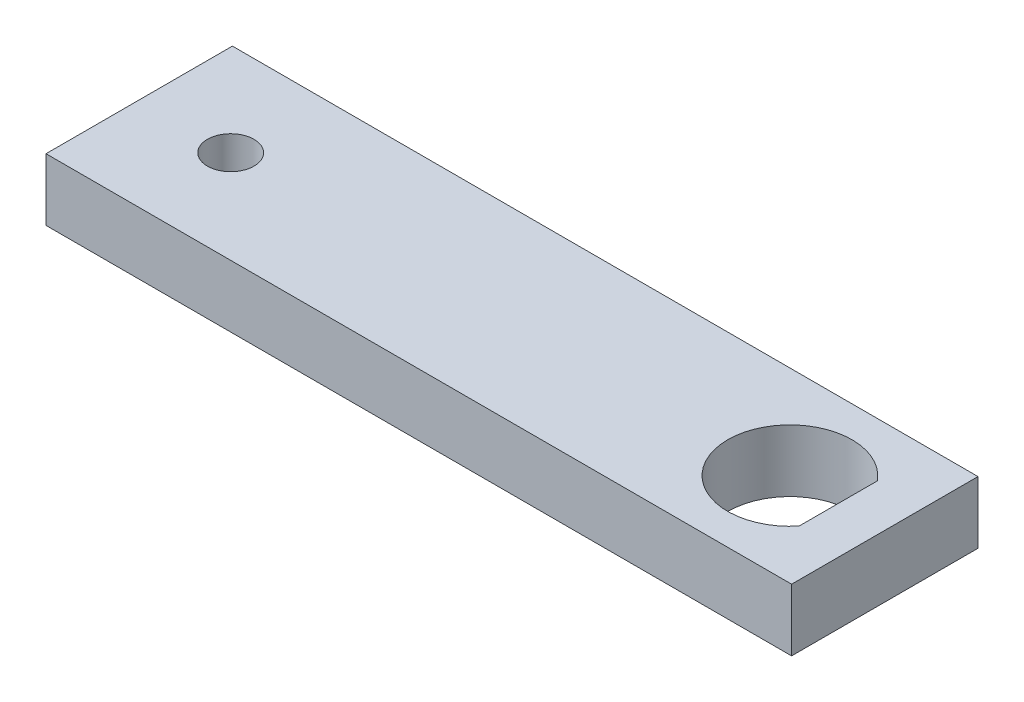
ISO-10303-21;
HEADER;
FILE_DESCRIPTION(('STEP AP214'),'2;1');
FILE_NAME('part.step','',(''),(''),'','','');
FILE_SCHEMA(('AUTOMOTIVE_DESIGN { 1 0 10303 214 1 1 1 1 }'));
ENDSEC;
DATA;
#1=APPLICATION_CONTEXT('core data for automotive mechanical design processes');
#2=APPLICATION_PROTOCOL_DEFINITION('international standard','automotive_design',2000,#1);
#3=PRODUCT_CONTEXT('',#1,'mechanical');
#4=PRODUCT('Part','Part','',(#3));
#5=PRODUCT_RELATED_PRODUCT_CATEGORY('part','',(#4));
#6=PRODUCT_DEFINITION_FORMATION('','',#4);
#7=PRODUCT_DEFINITION_CONTEXT('part definition',#1,'design');
#8=PRODUCT_DEFINITION('design','',#6,#7);
#9=PRODUCT_DEFINITION_SHAPE('','',#8);
#10=(LENGTH_UNIT() NAMED_UNIT(*) SI_UNIT(.MILLI.,.METRE.));
#11=(NAMED_UNIT(*) PLANE_ANGLE_UNIT() SI_UNIT($,.RADIAN.));
#12=(NAMED_UNIT(*) SI_UNIT($,.STERADIAN.) SOLID_ANGLE_UNIT());
#13=UNCERTAINTY_MEASURE_WITH_UNIT(LENGTH_MEASURE(1.E-05),#10,'distance_accuracy_value','');
#14=(GEOMETRIC_REPRESENTATION_CONTEXT(3) GLOBAL_UNCERTAINTY_ASSIGNED_CONTEXT((#13)) GLOBAL_UNIT_ASSIGNED_CONTEXT((#10,
#11,#12)) REPRESENTATION_CONTEXT('',''));
#15=CARTESIAN_POINT('',(0.,0.,0.));
#16=DIRECTION('',(0.,0.,1.));
#17=DIRECTION('',(1.,0.,0.));
#18=AXIS2_PLACEMENT_3D('',#15,#16,#17);
#19=CARTESIAN_POINT('',(0.,3.175,0.));
#20=DIRECTION('',(0.,-1.,0.));
#21=DIRECTION('',(0.,0.,-1.));
#22=AXIS2_PLACEMENT_3D('',#19,#20,#21);
#23=PLANE('',#22);
#24=DIRECTION('',(0.,0.,-1.));
#25=VECTOR('',#24,1.);
#26=CARTESIAN_POINT('',(38.1,3.175,9.525));
#27=LINE('',#26,#25);
#28=CARTESIAN_POINT('',(38.1,3.175,9.525));
#29=VERTEX_POINT('',#28);
#30=CARTESIAN_POINT('',(38.1,3.175,-9.525));
#31=VERTEX_POINT('',#30);
#32=EDGE_CURVE('E126',#29,#31,#27,.T.);
#33=ORIENTED_EDGE('',*,*,#32,.T.);
#34=DIRECTION('',(-1.,0.,0.));
#35=VECTOR('',#34,1.);
#36=CARTESIAN_POINT('',(-38.1,3.175,-9.525));
#37=LINE('',#36,#35);
#38=CARTESIAN_POINT('',(-38.1,3.175,-9.525));
#39=VERTEX_POINT('',#38);
#40=EDGE_CURVE('E130',#31,#39,#37,.T.);
#41=ORIENTED_EDGE('',*,*,#40,.T.);
#42=DIRECTION('',(0.,0.,1.));
#43=VECTOR('',#42,1.);
#44=CARTESIAN_POINT('',(-38.1,3.175,9.525));
#45=LINE('',#44,#43);
#46=CARTESIAN_POINT('',(-38.1,3.175,9.525));
#47=VERTEX_POINT('',#46);
#48=EDGE_CURVE('E134',#39,#47,#45,.T.);
#49=ORIENTED_EDGE('',*,*,#48,.T.);
#50=DIRECTION('',(1.,0.,0.));
#51=VECTOR('',#50,1.);
#52=CARTESIAN_POINT('',(-38.1,3.175,9.525));
#53=LINE('',#52,#51);
#54=EDGE_CURVE('E137',#47,#29,#53,.T.);
#55=ORIENTED_EDGE('',*,*,#54,.T.);
#56=EDGE_LOOP('',(#33,#41,#49,#55));
#57=FACE_BOUND('',#56,.T.);
#58=CARTESIAN_POINT('',(28.4,3.175,0.));
#59=DIRECTION('',(0.,1.,0.));
#60=DIRECTION('',(0.,0.,1.));
#61=AXIS2_PLACEMENT_3D('',#58,#59,#60);
#62=CIRCLE('',#61,6.35);
#63=CARTESIAN_POINT('',(33.34,3.175,-3.98984962122635));
#64=VERTEX_POINT('',#63);
#65=CARTESIAN_POINT('',(33.34,3.175,3.98984962122634));
#66=VERTEX_POINT('',#65);
#67=EDGE_CURVE('E105',#64,#66,#62,.T.);
#68=ORIENTED_EDGE('',*,*,#67,.F.);
#69=DIRECTION('',(0.,0.,-1.));
#70=VECTOR('',#69,1.);
#71=CARTESIAN_POINT('',(33.34,3.175,-3.98984962122635));
#72=LINE('',#71,#70);
#73=EDGE_CURVE('E98',#66,#64,#72,.T.);
#74=ORIENTED_EDGE('',*,*,#73,.F.);
#75=EDGE_LOOP('',(#68,#74));
#76=FACE_BOUND('',#75,.T.);
#77=CARTESIAN_POINT('',(-28.75,3.175,0.));
#78=DIRECTION('',(0.,1.,0.));
#79=DIRECTION('',(0.,0.,1.));
#80=AXIS2_PLACEMENT_3D('',#77,#78,#79);
#81=CIRCLE('',#80,2.38);
#82=CARTESIAN_POINT('',(-28.75,3.175,2.38));
#83=VERTEX_POINT('',#82);
#84=EDGE_CURVE('E121',#83,#83,#81,.T.);
#85=ORIENTED_EDGE('',*,*,#84,.F.);
#86=EDGE_LOOP('',(#85));
#87=FACE_BOUND('',#86,.T.);
#88=ADVANCED_FACE('F45',(#57,#76,#87),#23,.F.);
#89=CARTESIAN_POINT('',(0.,-3.175,0.));
#90=DIRECTION('',(0.,-1.,0.));
#91=DIRECTION('',(0.,0.,-1.));
#92=AXIS2_PLACEMENT_3D('',#89,#90,#91);
#93=PLANE('',#92);
#94=DIRECTION('',(0.,0.,-1.));
#95=VECTOR('',#94,1.);
#96=CARTESIAN_POINT('',(33.34,-3.175,-3.98984962122635));
#97=LINE('',#96,#95);
#98=CARTESIAN_POINT('',(33.34,-3.175,3.98984962122634));
#99=VERTEX_POINT('',#98);
#100=CARTESIAN_POINT('',(33.34,-3.175,-3.98984962122635));
#101=VERTEX_POINT('',#100);
#102=EDGE_CURVE('E112',#99,#101,#97,.T.);
#103=ORIENTED_EDGE('',*,*,#102,.T.);
#104=CARTESIAN_POINT('',(28.4,-3.175,0.));
#105=DIRECTION('',(0.,1.,0.));
#106=DIRECTION('',(0.,0.,1.));
#107=AXIS2_PLACEMENT_3D('',#104,#105,#106);
#108=CIRCLE('',#107,6.35);
#109=EDGE_CURVE('E68',#101,#99,#108,.T.);
#110=ORIENTED_EDGE('',*,*,#109,.T.);
#111=EDGE_LOOP('',(#103,#110));
#112=FACE_BOUND('',#111,.T.);
#113=DIRECTION('',(0.,0.,-1.));
#114=VECTOR('',#113,1.);
#115=CARTESIAN_POINT('',(38.1,-3.175,9.525));
#116=LINE('',#115,#114);
#117=CARTESIAN_POINT('',(38.1,-3.175,9.525));
#118=VERTEX_POINT('',#117);
#119=CARTESIAN_POINT('',(38.1,-3.175,-9.525));
#120=VERTEX_POINT('',#119);
#121=EDGE_CURVE('E125',#118,#120,#116,.T.);
#122=ORIENTED_EDGE('',*,*,#121,.F.);
#123=DIRECTION('',(1.,0.,0.));
#124=VECTOR('',#123,1.);
#125=CARTESIAN_POINT('',(-38.1,-3.175,9.525));
#126=LINE('',#125,#124);
#127=CARTESIAN_POINT('',(-38.1,-3.175,9.525));
#128=VERTEX_POINT('',#127);
#129=EDGE_CURVE('E131',#128,#118,#126,.T.);
#130=ORIENTED_EDGE('',*,*,#129,.F.);
#131=DIRECTION('',(0.,0.,1.));
#132=VECTOR('',#131,1.);
#133=CARTESIAN_POINT('',(-38.1,-3.175,9.525));
#134=LINE('',#133,#132);
#135=CARTESIAN_POINT('',(-38.1,-3.175,-9.525));
#136=VERTEX_POINT('',#135);
#137=EDGE_CURVE('E147',#136,#128,#134,.T.);
#138=ORIENTED_EDGE('',*,*,#137,.F.);
#139=DIRECTION('',(-1.,0.,0.));
#140=VECTOR('',#139,1.);
#141=CARTESIAN_POINT('',(-38.1,-3.175,-9.525));
#142=LINE('',#141,#140);
#143=EDGE_CURVE('E144',#120,#136,#142,.T.);
#144=ORIENTED_EDGE('',*,*,#143,.F.);
#145=EDGE_LOOP('',(#122,#130,#138,#144));
#146=FACE_BOUND('',#145,.T.);
#147=CARTESIAN_POINT('',(-28.75,-3.175,0.));
#148=DIRECTION('',(0.,1.,0.));
#149=DIRECTION('',(0.,0.,1.));
#150=AXIS2_PLACEMENT_3D('',#147,#148,#149);
#151=CIRCLE('',#150,2.38);
#152=CARTESIAN_POINT('',(-28.75,-3.175,2.38));
#153=VERTEX_POINT('',#152);
#154=EDGE_CURVE('E117',#153,#153,#151,.T.);
#155=ORIENTED_EDGE('',*,*,#154,.T.);
#156=EDGE_LOOP('',(#155));
#157=FACE_BOUND('',#156,.T.);
#158=ADVANCED_FACE('F170',(#112,#146,#157),#93,.T.);
#159=CARTESIAN_POINT('',(38.1,3.175,9.525));
#160=DIRECTION('',(-1.,0.,0.));
#161=DIRECTION('',(0.,0.,1.));
#162=AXIS2_PLACEMENT_3D('',#159,#160,#161);
#163=PLANE('',#162);
#164=ORIENTED_EDGE('',*,*,#121,.T.);
#165=DIRECTION('',(0.,-1.,0.));
#166=VECTOR('',#165,1.);
#167=CARTESIAN_POINT('',(38.1,3.175,-9.525));
#168=LINE('',#167,#166);
#169=EDGE_CURVE('E11',#31,#120,#168,.T.);
#170=ORIENTED_EDGE('',*,*,#169,.F.);
#171=ORIENTED_EDGE('',*,*,#32,.F.);
#172=DIRECTION('',(0.,-1.,0.));
#173=VECTOR('',#172,1.);
#174=CARTESIAN_POINT('',(38.1,3.175,9.525));
#175=LINE('',#174,#173);
#176=EDGE_CURVE('E140',#29,#118,#175,.T.);
#177=ORIENTED_EDGE('',*,*,#176,.T.);
#178=EDGE_LOOP('',(#164,#170,#171,#177));
#179=FACE_BOUND('',#178,.T.);
#180=ADVANCED_FACE('F47',(#179),#163,.F.);
#181=CARTESIAN_POINT('',(-38.1,3.175,-9.525));
#182=DIRECTION('',(0.,0.,1.));
#183=DIRECTION('',(1.,0.,0.));
#184=AXIS2_PLACEMENT_3D('',#181,#182,#183);
#185=PLANE('',#184);
#186=ORIENTED_EDGE('',*,*,#143,.T.);
#187=DIRECTION('',(0.,-1.,0.));
#188=VECTOR('',#187,1.);
#189=CARTESIAN_POINT('',(-38.1,3.175,-9.525));
#190=LINE('',#189,#188);
#191=EDGE_CURVE('E54',#39,#136,#190,.T.);
#192=ORIENTED_EDGE('',*,*,#191,.F.);
#193=ORIENTED_EDGE('',*,*,#40,.F.);
#194=ORIENTED_EDGE('',*,*,#169,.T.);
#195=EDGE_LOOP('',(#186,#192,#193,#194));
#196=FACE_BOUND('',#195,.T.);
#197=ADVANCED_FACE('F180',(#196),#185,.F.);
#198=CARTESIAN_POINT('',(-38.1,3.175,9.525));
#199=DIRECTION('',(1.,0.,0.));
#200=DIRECTION('',(0.,0.,-1.));
#201=AXIS2_PLACEMENT_3D('',#198,#199,#200);
#202=PLANE('',#201);
#203=ORIENTED_EDGE('',*,*,#137,.T.);
#204=DIRECTION('',(0.,-1.,0.));
#205=VECTOR('',#204,1.);
#206=CARTESIAN_POINT('',(-38.1,3.175,9.525));
#207=LINE('',#206,#205);
#208=EDGE_CURVE('E155',#47,#128,#207,.T.);
#209=ORIENTED_EDGE('',*,*,#208,.F.);
#210=ORIENTED_EDGE('',*,*,#48,.F.);
#211=ORIENTED_EDGE('',*,*,#191,.T.);
#212=EDGE_LOOP('',(#203,#209,#210,#211));
#213=FACE_BOUND('',#212,.T.);
#214=ADVANCED_FACE('F164',(#213),#202,.F.);
#215=CARTESIAN_POINT('',(-38.1,3.175,9.525));
#216=DIRECTION('',(0.,0.,-1.));
#217=DIRECTION('',(-1.,0.,0.));
#218=AXIS2_PLACEMENT_3D('',#215,#216,#217);
#219=PLANE('',#218);
#220=ORIENTED_EDGE('',*,*,#129,.T.);
#221=ORIENTED_EDGE('',*,*,#176,.F.);
#222=ORIENTED_EDGE('',*,*,#54,.F.);
#223=ORIENTED_EDGE('',*,*,#208,.T.);
#224=EDGE_LOOP('',(#220,#221,#222,#223));
#225=FACE_BOUND('',#224,.T.);
#226=ADVANCED_FACE('F174',(#225),#219,.F.);
#227=CARTESIAN_POINT('',(28.4,3.175,0.));
#228=DIRECTION('',(0.,-1.,0.));
#229=DIRECTION('',(0.,0.,-1.));
#230=AXIS2_PLACEMENT_3D('',#227,#228,#229);
#231=CYLINDRICAL_SURFACE('',#230,6.35);
#232=ORIENTED_EDGE('',*,*,#109,.F.);
#233=DIRECTION('',(0.,-1.,0.));
#234=VECTOR('',#233,1.);
#235=CARTESIAN_POINT('',(33.34,3.175,-3.98984962122635));
#236=LINE('',#235,#234);
#237=EDGE_CURVE('E100',#64,#101,#236,.T.);
#238=ORIENTED_EDGE('',*,*,#237,.F.);
#239=ORIENTED_EDGE('',*,*,#67,.T.);
#240=DIRECTION('',(0.,-1.,0.));
#241=VECTOR('',#240,1.);
#242=CARTESIAN_POINT('',(33.34,3.175,3.98984962122634));
#243=LINE('',#242,#241);
#244=EDGE_CURVE('E61',#66,#99,#243,.T.);
#245=ORIENTED_EDGE('',*,*,#244,.T.);
#246=EDGE_LOOP('',(#232,#238,#239,#245));
#247=FACE_BOUND('',#246,.T.);
#248=ADVANCED_FACE('F107',(#247),#231,.F.);
#249=CARTESIAN_POINT('',(33.34,3.175,-3.98984962122635));
#250=DIRECTION('',(-1.,0.,0.));
#251=DIRECTION('',(0.,0.,1.));
#252=AXIS2_PLACEMENT_3D('',#249,#250,#251);
#253=PLANE('',#252);
#254=ORIENTED_EDGE('',*,*,#102,.F.);
#255=ORIENTED_EDGE('',*,*,#244,.F.);
#256=ORIENTED_EDGE('',*,*,#73,.T.);
#257=ORIENTED_EDGE('',*,*,#237,.T.);
#258=EDGE_LOOP('',(#254,#255,#256,#257));
#259=FACE_BOUND('',#258,.T.);
#260=ADVANCED_FACE('F99',(#259),#253,.T.);
#261=CARTESIAN_POINT('',(-28.75,3.175,0.));
#262=DIRECTION('',(0.,-1.,0.));
#263=DIRECTION('',(0.,0.,-1.));
#264=AXIS2_PLACEMENT_3D('',#261,#262,#263);
#265=CYLINDRICAL_SURFACE('',#264,2.38);
#266=ORIENTED_EDGE('',*,*,#84,.T.);
#267=EDGE_LOOP('',(#266));
#268=FACE_BOUND('',#267,.T.);
#269=ORIENTED_EDGE('',*,*,#154,.F.);
#270=EDGE_LOOP('',(#269));
#271=FACE_BOUND('',#270,.T.);
#272=ADVANCED_FACE('F204',(#268,#271),#265,.F.);
#273=CLOSED_SHELL('',(#88,#158,#180,#197,#214,#226,#248,#260,#272));
#274=MANIFOLD_SOLID_BREP('B2',#273);
#275=ADVANCED_BREP_SHAPE_REPRESENTATION('',(#18,#274),#14);
#276=SHAPE_DEFINITION_REPRESENTATION(#9,#275);
ENDSEC;
END-ISO-10303-21;
